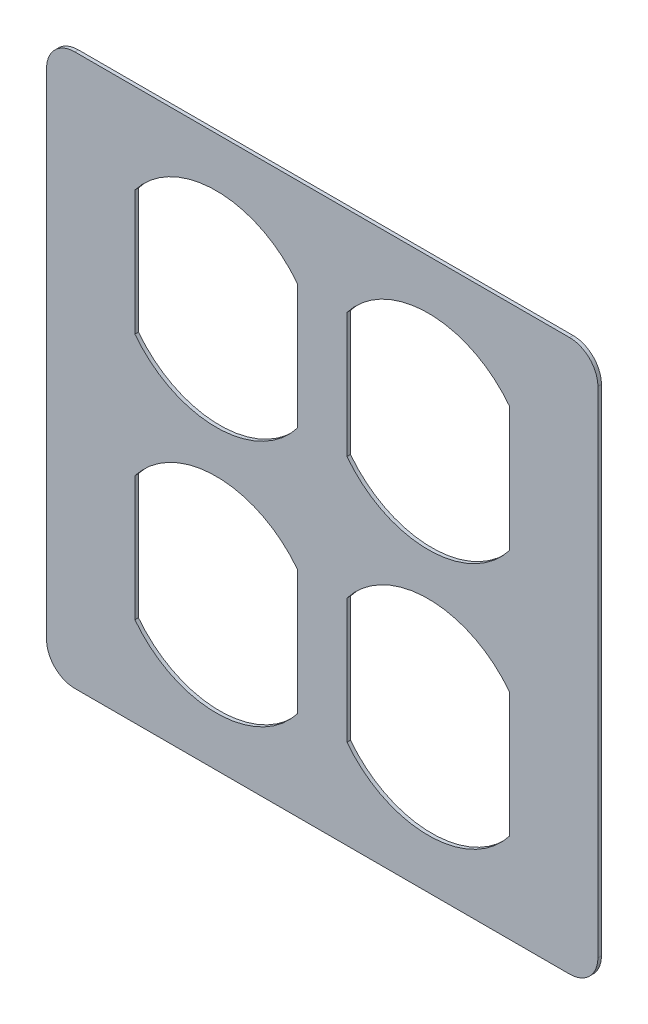
ISO-10303-21;
HEADER;
FILE_DESCRIPTION(('STEP AP214'),'2;1');
FILE_NAME('part.step','',(''),(''),'','','');
FILE_SCHEMA(('AUTOMOTIVE_DESIGN { 1 0 10303 214 1 1 1 1 }'));
ENDSEC;
DATA;
#1=APPLICATION_CONTEXT('core data for automotive mechanical design processes');
#2=APPLICATION_PROTOCOL_DEFINITION('international standard','automotive_design',2000,#1);
#3=PRODUCT_CONTEXT('',#1,'mechanical');
#4=PRODUCT('Part','Part','',(#3));
#5=PRODUCT_RELATED_PRODUCT_CATEGORY('part','',(#4));
#6=PRODUCT_DEFINITION_FORMATION('','',#4);
#7=PRODUCT_DEFINITION_CONTEXT('part definition',#1,'design');
#8=PRODUCT_DEFINITION('design','',#6,#7);
#9=PRODUCT_DEFINITION_SHAPE('','',#8);
#10=(LENGTH_UNIT() NAMED_UNIT(*) SI_UNIT(.MILLI.,.METRE.));
#11=(NAMED_UNIT(*) PLANE_ANGLE_UNIT() SI_UNIT($,.RADIAN.));
#12=(NAMED_UNIT(*) SI_UNIT($,.STERADIAN.) SOLID_ANGLE_UNIT());
#13=UNCERTAINTY_MEASURE_WITH_UNIT(LENGTH_MEASURE(1.E-05),#10,'distance_accuracy_value','');
#14=(GEOMETRIC_REPRESENTATION_CONTEXT(3) GLOBAL_UNCERTAINTY_ASSIGNED_CONTEXT((#13)) GLOBAL_UNIT_ASSIGNED_CONTEXT((#10,
#11,#12)) REPRESENTATION_CONTEXT('',''));
#15=CARTESIAN_POINT('',(0.,0.,0.));
#16=DIRECTION('',(0.,0.,1.));
#17=DIRECTION('',(1.,0.,0.));
#18=AXIS2_PLACEMENT_3D('',#15,#16,#17);
#19=CARTESIAN_POINT('',(0.,0.,0.5));
#20=DIRECTION('',(0.,0.,1.));
#21=DIRECTION('',(1.,0.,0.));
#22=AXIS2_PLACEMENT_3D('',#19,#20,#21);
#23=PLANE('',#22);
#24=DIRECTION('',(0.,1.,0.));
#25=VECTOR('',#24,1.);
#26=CARTESIAN_POINT('',(-26.5,8.66823913367216,0.5));
#27=LINE('',#26,#25);
#28=CARTESIAN_POINT('',(-26.5,8.66823913367216,0.5));
#29=VERTEX_POINT('',#28);
#30=CARTESIAN_POINT('',(-26.5,26.3317608663278,0.5));
#31=VERTEX_POINT('',#30);
#32=EDGE_CURVE('E397',#29,#31,#27,.T.);
#33=ORIENTED_EDGE('',*,*,#32,.T.);
#34=CARTESIAN_POINT('',(-15.,17.5,0.5));
#35=DIRECTION('',(0.,0.,1.));
#36=DIRECTION('',(1.,0.,0.));
#37=AXIS2_PLACEMENT_3D('',#34,#35,#36);
#38=CIRCLE('',#37,14.5);
#39=CARTESIAN_POINT('',(-3.5,26.3317608663278,0.5));
#40=VERTEX_POINT('',#39);
#41=EDGE_CURVE('E388',#31,#40,#38,.F.);
#42=ORIENTED_EDGE('',*,*,#41,.T.);
#43=DIRECTION('',(0.,-1.,0.));
#44=VECTOR('',#43,1.);
#45=CARTESIAN_POINT('',(-3.5,8.66823913367216,0.5));
#46=LINE('',#45,#44);
#47=CARTESIAN_POINT('',(-3.5,8.66823913367216,0.5));
#48=VERTEX_POINT('',#47);
#49=EDGE_CURVE('E391',#40,#48,#46,.T.);
#50=ORIENTED_EDGE('',*,*,#49,.T.);
#51=CARTESIAN_POINT('',(-15.,17.5,0.5));
#52=DIRECTION('',(0.,0.,1.));
#53=DIRECTION('',(1.,0.,0.));
#54=AXIS2_PLACEMENT_3D('',#51,#52,#53);
#55=CIRCLE('',#54,14.5);
#56=EDGE_CURVE('E394',#48,#29,#55,.F.);
#57=ORIENTED_EDGE('',*,*,#56,.T.);
#58=EDGE_LOOP('',(#33,#42,#50,#57));
#59=FACE_BOUND('',#58,.T.);
#60=CARTESIAN_POINT('',(15.,17.5,0.5));
#61=DIRECTION('',(0.,0.,1.));
#62=DIRECTION('',(1.,0.,0.));
#63=AXIS2_PLACEMENT_3D('',#60,#61,#62);
#64=CIRCLE('',#63,14.5);
#65=CARTESIAN_POINT('',(26.5,8.66823913367216,0.5));
#66=VERTEX_POINT('',#65);
#67=CARTESIAN_POINT('',(3.49999999999999,8.66823913367216,0.5));
#68=VERTEX_POINT('',#67);
#69=EDGE_CURVE('E297',#66,#68,#64,.F.);
#70=ORIENTED_EDGE('',*,*,#69,.T.);
#71=DIRECTION('',(0.,1.,0.));
#72=VECTOR('',#71,1.);
#73=CARTESIAN_POINT('',(3.49999999999999,8.66823913367216,0.5));
#74=LINE('',#73,#72);
#75=CARTESIAN_POINT('',(3.49999999999999,26.3317608663278,0.5));
#76=VERTEX_POINT('',#75);
#77=EDGE_CURVE('E294',#68,#76,#74,.T.);
#78=ORIENTED_EDGE('',*,*,#77,.T.);
#79=CARTESIAN_POINT('',(15.,17.5,0.5));
#80=DIRECTION('',(0.,0.,1.));
#81=DIRECTION('',(1.,0.,0.));
#82=AXIS2_PLACEMENT_3D('',#79,#80,#81);
#83=CIRCLE('',#82,14.5);
#84=CARTESIAN_POINT('',(26.5,26.3317608663278,0.5));
#85=VERTEX_POINT('',#84);
#86=EDGE_CURVE('E214',#76,#85,#83,.F.);
#87=ORIENTED_EDGE('',*,*,#86,.T.);
#88=DIRECTION('',(0.,-1.,0.));
#89=VECTOR('',#88,1.);
#90=CARTESIAN_POINT('',(26.5,8.66823913367216,0.5));
#91=LINE('',#90,#89);
#92=EDGE_CURVE('E303',#85,#66,#91,.T.);
#93=ORIENTED_EDGE('',*,*,#92,.T.);
#94=EDGE_LOOP('',(#70,#78,#87,#93));
#95=FACE_BOUND('',#94,.T.);
#96=CARTESIAN_POINT('',(15.,-17.5,0.5));
#97=DIRECTION('',(0.,0.,1.));
#98=DIRECTION('',(1.,0.,0.));
#99=AXIS2_PLACEMENT_3D('',#96,#97,#98);
#100=CIRCLE('',#99,14.5);
#101=CARTESIAN_POINT('',(26.5,-26.3317608663278,0.5));
#102=VERTEX_POINT('',#101);
#103=CARTESIAN_POINT('',(3.49999999999999,-26.3317608663278,0.5));
#104=VERTEX_POINT('',#103);
#105=EDGE_CURVE('E213',#102,#104,#100,.F.);
#106=ORIENTED_EDGE('',*,*,#105,.T.);
#107=DIRECTION('',(0.,1.,0.));
#108=VECTOR('',#107,1.);
#109=CARTESIAN_POINT('',(3.49999999999999,-26.3317608663278,0.5));
#110=LINE('',#109,#108);
#111=CARTESIAN_POINT('',(3.49999999999999,-8.66823913367216,0.5));
#112=VERTEX_POINT('',#111);
#113=EDGE_CURVE('E199',#104,#112,#110,.T.);
#114=ORIENTED_EDGE('',*,*,#113,.T.);
#115=CARTESIAN_POINT('',(15.,-17.5,0.5));
#116=DIRECTION('',(0.,0.,1.));
#117=DIRECTION('',(1.,0.,0.));
#118=AXIS2_PLACEMENT_3D('',#115,#116,#117);
#119=CIRCLE('',#118,14.5);
#120=CARTESIAN_POINT('',(26.5,-8.66823913367216,0.5));
#121=VERTEX_POINT('',#120);
#122=EDGE_CURVE('E211',#112,#121,#119,.F.);
#123=ORIENTED_EDGE('',*,*,#122,.T.);
#124=DIRECTION('',(0.,-1.,0.));
#125=VECTOR('',#124,1.);
#126=CARTESIAN_POINT('',(26.5,-26.3317608663278,0.5));
#127=LINE('',#126,#125);
#128=EDGE_CURVE('E219',#121,#102,#127,.T.);
#129=ORIENTED_EDGE('',*,*,#128,.T.);
#130=EDGE_LOOP('',(#106,#114,#123,#129));
#131=FACE_BOUND('',#130,.T.);
#132=DIRECTION('',(0.,1.,0.));
#133=VECTOR('',#132,1.);
#134=CARTESIAN_POINT('',(-26.5,-26.3317608663278,0.5));
#135=LINE('',#134,#133);
#136=CARTESIAN_POINT('',(-26.5,-26.3317608663278,0.5));
#137=VERTEX_POINT('',#136);
#138=CARTESIAN_POINT('',(-26.5,-8.66823913367216,0.5));
#139=VERTEX_POINT('',#138);
#140=EDGE_CURVE('E289',#137,#139,#135,.T.);
#141=ORIENTED_EDGE('',*,*,#140,.T.);
#142=CARTESIAN_POINT('',(-15.,-17.5,0.5));
#143=DIRECTION('',(0.,0.,1.));
#144=DIRECTION('',(1.,0.,0.));
#145=AXIS2_PLACEMENT_3D('',#142,#143,#144);
#146=CIRCLE('',#145,14.5);
#147=CARTESIAN_POINT('',(-3.5,-8.66823913367216,0.5));
#148=VERTEX_POINT('',#147);
#149=EDGE_CURVE('E400',#139,#148,#146,.F.);
#150=ORIENTED_EDGE('',*,*,#149,.T.);
#151=DIRECTION('',(0.,-1.,0.));
#152=VECTOR('',#151,1.);
#153=CARTESIAN_POINT('',(-3.5,-26.3317608663278,0.5));
#154=LINE('',#153,#152);
#155=CARTESIAN_POINT('',(-3.5,-26.3317608663278,0.5));
#156=VERTEX_POINT('',#155);
#157=EDGE_CURVE('E291',#148,#156,#154,.T.);
#158=ORIENTED_EDGE('',*,*,#157,.T.);
#159=CARTESIAN_POINT('',(-15.,-17.5,0.5));
#160=DIRECTION('',(0.,0.,1.));
#161=DIRECTION('',(1.,0.,0.));
#162=AXIS2_PLACEMENT_3D('',#159,#160,#161);
#163=CIRCLE('',#162,14.5);
#164=EDGE_CURVE('E283',#156,#137,#163,.F.);
#165=ORIENTED_EDGE('',*,*,#164,.T.);
#166=EDGE_LOOP('',(#141,#150,#158,#165));
#167=FACE_BOUND('',#166,.T.);
#168=CARTESIAN_POINT('',(35.,35.,0.5));
#169=DIRECTION('',(0.,0.,1.));
#170=DIRECTION('',(1.,0.,0.));
#171=AXIS2_PLACEMENT_3D('',#168,#169,#170);
#172=CIRCLE('',#171,4.);
#173=CARTESIAN_POINT('',(35.,39.,0.5));
#174=VERTEX_POINT('',#173);
#175=CARTESIAN_POINT('',(39.,35.,0.5));
#176=VERTEX_POINT('',#175);
#177=EDGE_CURVE('E374',#174,#176,#172,.F.);
#178=ORIENTED_EDGE('',*,*,#177,.F.);
#179=DIRECTION('',(-1.,0.,0.));
#180=VECTOR('',#179,1.);
#181=CARTESIAN_POINT('',(-39.,39.,0.5));
#182=LINE('',#181,#180);
#183=CARTESIAN_POINT('',(-35.,39.,0.5));
#184=VERTEX_POINT('',#183);
#185=EDGE_CURVE('E376',#174,#184,#182,.T.);
#186=ORIENTED_EDGE('',*,*,#185,.T.);
#187=CARTESIAN_POINT('',(-35.,35.,0.5));
#188=DIRECTION('',(0.,0.,1.));
#189=DIRECTION('',(1.,0.,0.));
#190=AXIS2_PLACEMENT_3D('',#187,#188,#189);
#191=CIRCLE('',#190,4.);
#192=CARTESIAN_POINT('',(-39.,35.,0.5));
#193=VERTEX_POINT('',#192);
#194=EDGE_CURVE('E370',#193,#184,#191,.F.);
#195=ORIENTED_EDGE('',*,*,#194,.F.);
#196=DIRECTION('',(0.,-1.,0.));
#197=VECTOR('',#196,1.);
#198=CARTESIAN_POINT('',(-39.,-39.,0.5));
#199=LINE('',#198,#197);
#200=CARTESIAN_POINT('',(-39.,-35.,0.5));
#201=VERTEX_POINT('',#200);
#202=EDGE_CURVE('E382',#193,#201,#199,.T.);
#203=ORIENTED_EDGE('',*,*,#202,.T.);
#204=CARTESIAN_POINT('',(-35.,-35.,0.5));
#205=DIRECTION('',(0.,0.,1.));
#206=DIRECTION('',(1.,0.,0.));
#207=AXIS2_PLACEMENT_3D('',#204,#205,#206);
#208=CIRCLE('',#207,4.);
#209=CARTESIAN_POINT('',(-35.,-39.,0.5));
#210=VERTEX_POINT('',#209);
#211=EDGE_CURVE('E227',#210,#201,#208,.F.);
#212=ORIENTED_EDGE('',*,*,#211,.F.);
#213=DIRECTION('',(1.,0.,0.));
#214=VECTOR('',#213,1.);
#215=CARTESIAN_POINT('',(-39.,-39.,0.5));
#216=LINE('',#215,#214);
#217=CARTESIAN_POINT('',(35.,-39.,0.5));
#218=VERTEX_POINT('',#217);
#219=EDGE_CURVE('E385',#210,#218,#216,.T.);
#220=ORIENTED_EDGE('',*,*,#219,.T.);
#221=CARTESIAN_POINT('',(35.,-35.,0.5));
#222=DIRECTION('',(0.,0.,1.));
#223=DIRECTION('',(1.,0.,0.));
#224=AXIS2_PLACEMENT_3D('',#221,#222,#223);
#225=CIRCLE('',#224,4.);
#226=CARTESIAN_POINT('',(39.,-35.,0.5));
#227=VERTEX_POINT('',#226);
#228=EDGE_CURVE('E372',#227,#218,#225,.F.);
#229=ORIENTED_EDGE('',*,*,#228,.F.);
#230=DIRECTION('',(0.,1.,0.));
#231=VECTOR('',#230,1.);
#232=CARTESIAN_POINT('',(39.,-39.,0.5));
#233=LINE('',#232,#231);
#234=EDGE_CURVE('E379',#227,#176,#233,.T.);
#235=ORIENTED_EDGE('',*,*,#234,.T.);
#236=EDGE_LOOP('',(#178,#186,#195,#203,#212,#220,#229,#235));
#237=FACE_BOUND('',#236,.T.);
#238=ADVANCED_FACE('F33',(#59,#95,#131,#167,#237),#23,.T.);
#239=CARTESIAN_POINT('',(-39.,39.,0.5));
#240=DIRECTION('',(0.,-1.,0.));
#241=DIRECTION('',(0.,0.,-1.));
#242=AXIS2_PLACEMENT_3D('',#239,#240,#241);
#243=PLANE('',#242);
#244=ORIENTED_EDGE('',*,*,#185,.F.);
#245=DIRECTION('',(0.,0.,-1.));
#246=VECTOR('',#245,1.);
#247=CARTESIAN_POINT('',(35.,39.,0.5));
#248=LINE('',#247,#246);
#249=CARTESIAN_POINT('',(35.,39.,0.));
#250=VERTEX_POINT('',#249);
#251=EDGE_CURVE('E257',#174,#250,#248,.T.);
#252=ORIENTED_EDGE('',*,*,#251,.T.);
#253=DIRECTION('',(-1.,0.,0.));
#254=VECTOR('',#253,1.);
#255=CARTESIAN_POINT('',(-39.,39.,0.));
#256=LINE('',#255,#254);
#257=CARTESIAN_POINT('',(-35.,39.,0.));
#258=VERTEX_POINT('',#257);
#259=EDGE_CURVE('E348',#250,#258,#256,.T.);
#260=ORIENTED_EDGE('',*,*,#259,.T.);
#261=DIRECTION('',(0.,0.,-1.));
#262=VECTOR('',#261,1.);
#263=CARTESIAN_POINT('',(-35.,39.,0.5));
#264=LINE('',#263,#262);
#265=EDGE_CURVE('E259',#258,#184,#264,.F.);
#266=ORIENTED_EDGE('',*,*,#265,.T.);
#267=EDGE_LOOP('',(#244,#252,#260,#266));
#268=FACE_BOUND('',#267,.T.);
#269=ADVANCED_FACE('F422',(#268),#243,.F.);
#270=CARTESIAN_POINT('',(39.,-39.,0.5));
#271=DIRECTION('',(-1.,0.,0.));
#272=DIRECTION('',(0.,0.,1.));
#273=AXIS2_PLACEMENT_3D('',#270,#271,#272);
#274=PLANE('',#273);
#275=ORIENTED_EDGE('',*,*,#234,.F.);
#276=DIRECTION('',(0.,0.,-1.));
#277=VECTOR('',#276,1.);
#278=CARTESIAN_POINT('',(39.,-35.,0.5));
#279=LINE('',#278,#277);
#280=CARTESIAN_POINT('',(39.,-35.,0.));
#281=VERTEX_POINT('',#280);
#282=EDGE_CURVE('E254',#227,#281,#279,.T.);
#283=ORIENTED_EDGE('',*,*,#282,.T.);
#284=DIRECTION('',(0.,1.,0.));
#285=VECTOR('',#284,1.);
#286=CARTESIAN_POINT('',(39.,-39.,0.));
#287=LINE('',#286,#285);
#288=CARTESIAN_POINT('',(39.,35.,0.));
#289=VERTEX_POINT('',#288);
#290=EDGE_CURVE('E267',#281,#289,#287,.T.);
#291=ORIENTED_EDGE('',*,*,#290,.T.);
#292=DIRECTION('',(0.,0.,-1.));
#293=VECTOR('',#292,1.);
#294=CARTESIAN_POINT('',(39.,35.,0.5));
#295=LINE('',#294,#293);
#296=EDGE_CURVE('E251',#289,#176,#295,.F.);
#297=ORIENTED_EDGE('',*,*,#296,.T.);
#298=EDGE_LOOP('',(#275,#283,#291,#297));
#299=FACE_BOUND('',#298,.T.);
#300=ADVANCED_FACE('F424',(#299),#274,.F.);
#301=CARTESIAN_POINT('',(-39.,-39.,0.5));
#302=DIRECTION('',(1.,0.,0.));
#303=DIRECTION('',(0.,0.,-1.));
#304=AXIS2_PLACEMENT_3D('',#301,#302,#303);
#305=PLANE('',#304);
#306=ORIENTED_EDGE('',*,*,#202,.F.);
#307=DIRECTION('',(0.,0.,-1.));
#308=VECTOR('',#307,1.);
#309=CARTESIAN_POINT('',(-39.,35.,0.5));
#310=LINE('',#309,#308);
#311=CARTESIAN_POINT('',(-39.,35.,0.));
#312=VERTEX_POINT('',#311);
#313=EDGE_CURVE('E240',#193,#312,#310,.T.);
#314=ORIENTED_EDGE('',*,*,#313,.T.);
#315=DIRECTION('',(0.,-1.,0.));
#316=VECTOR('',#315,1.);
#317=CARTESIAN_POINT('',(-39.,-39.,0.));
#318=LINE('',#317,#316);
#319=CARTESIAN_POINT('',(-39.,-35.,0.));
#320=VERTEX_POINT('',#319);
#321=EDGE_CURVE('E346',#312,#320,#318,.T.);
#322=ORIENTED_EDGE('',*,*,#321,.T.);
#323=DIRECTION('',(0.,0.,-1.));
#324=VECTOR('',#323,1.);
#325=CARTESIAN_POINT('',(-39.,-35.,0.5));
#326=LINE('',#325,#324);
#327=EDGE_CURVE('E242',#320,#201,#326,.F.);
#328=ORIENTED_EDGE('',*,*,#327,.T.);
#329=EDGE_LOOP('',(#306,#314,#322,#328));
#330=FACE_BOUND('',#329,.T.);
#331=ADVANCED_FACE('F431',(#330),#305,.F.);
#332=CARTESIAN_POINT('',(-39.,-39.,0.5));
#333=DIRECTION('',(0.,1.,0.));
#334=DIRECTION('',(0.,0.,1.));
#335=AXIS2_PLACEMENT_3D('',#332,#333,#334);
#336=PLANE('',#335);
#337=ORIENTED_EDGE('',*,*,#219,.F.);
#338=DIRECTION('',(0.,0.,-1.));
#339=VECTOR('',#338,1.);
#340=CARTESIAN_POINT('',(-35.,-39.,0.5));
#341=LINE('',#340,#339);
#342=CARTESIAN_POINT('',(-35.,-39.,0.));
#343=VERTEX_POINT('',#342);
#344=EDGE_CURVE('E249',#210,#343,#341,.T.);
#345=ORIENTED_EDGE('',*,*,#344,.T.);
#346=DIRECTION('',(1.,0.,0.));
#347=VECTOR('',#346,1.);
#348=CARTESIAN_POINT('',(-39.,-39.,0.));
#349=LINE('',#348,#347);
#350=CARTESIAN_POINT('',(35.,-39.,0.));
#351=VERTEX_POINT('',#350);
#352=EDGE_CURVE('E263',#343,#351,#349,.T.);
#353=ORIENTED_EDGE('',*,*,#352,.T.);
#354=DIRECTION('',(0.,0.,-1.));
#355=VECTOR('',#354,1.);
#356=CARTESIAN_POINT('',(35.,-39.,0.5));
#357=LINE('',#356,#355);
#358=EDGE_CURVE('E246',#351,#218,#357,.F.);
#359=ORIENTED_EDGE('',*,*,#358,.T.);
#360=EDGE_LOOP('',(#337,#345,#353,#359));
#361=FACE_BOUND('',#360,.T.);
#362=ADVANCED_FACE('F441',(#361),#336,.F.);
#363=CARTESIAN_POINT('',(35.,35.,0.5));
#364=DIRECTION('',(0.,0.,-1.));
#365=DIRECTION('',(-1.,0.,0.));
#366=AXIS2_PLACEMENT_3D('',#363,#364,#365);
#367=CYLINDRICAL_SURFACE('',#366,4.);
#368=ORIENTED_EDGE('',*,*,#251,.F.);
#369=ORIENTED_EDGE('',*,*,#177,.T.);
#370=ORIENTED_EDGE('',*,*,#296,.F.);
#371=CARTESIAN_POINT('',(35.,35.,0.));
#372=DIRECTION('',(0.,0.,-1.));
#373=DIRECTION('',(-1.,0.,0.));
#374=AXIS2_PLACEMENT_3D('',#371,#372,#373);
#375=CIRCLE('',#374,4.);
#376=EDGE_CURVE('E256',#250,#289,#375,.T.);
#377=ORIENTED_EDGE('',*,*,#376,.F.);
#378=EDGE_LOOP('',(#368,#369,#370,#377));
#379=FACE_BOUND('',#378,.T.);
#380=ADVANCED_FACE('F35',(#379),#367,.T.);
#381=CARTESIAN_POINT('',(35.,-35.,0.5));
#382=DIRECTION('',(0.,0.,-1.));
#383=DIRECTION('',(-1.,0.,0.));
#384=AXIS2_PLACEMENT_3D('',#381,#382,#383);
#385=CYLINDRICAL_SURFACE('',#384,4.);
#386=ORIENTED_EDGE('',*,*,#282,.F.);
#387=ORIENTED_EDGE('',*,*,#228,.T.);
#388=ORIENTED_EDGE('',*,*,#358,.F.);
#389=CARTESIAN_POINT('',(35.,-35.,0.));
#390=DIRECTION('',(0.,0.,-1.));
#391=DIRECTION('',(-1.,0.,0.));
#392=AXIS2_PLACEMENT_3D('',#389,#390,#391);
#393=CIRCLE('',#392,4.);
#394=EDGE_CURVE('E338',#281,#351,#393,.T.);
#395=ORIENTED_EDGE('',*,*,#394,.F.);
#396=EDGE_LOOP('',(#386,#387,#388,#395));
#397=FACE_BOUND('',#396,.T.);
#398=ADVANCED_FACE('F625',(#397),#385,.T.);
#399=CARTESIAN_POINT('',(-35.,35.,0.5));
#400=DIRECTION('',(0.,0.,-1.));
#401=DIRECTION('',(-1.,0.,0.));
#402=AXIS2_PLACEMENT_3D('',#399,#400,#401);
#403=CYLINDRICAL_SURFACE('',#402,4.);
#404=ORIENTED_EDGE('',*,*,#313,.F.);
#405=ORIENTED_EDGE('',*,*,#194,.T.);
#406=ORIENTED_EDGE('',*,*,#265,.F.);
#407=CARTESIAN_POINT('',(-35.,35.,0.));
#408=DIRECTION('',(0.,0.,-1.));
#409=DIRECTION('',(-1.,0.,0.));
#410=AXIS2_PLACEMENT_3D('',#407,#408,#409);
#411=CIRCLE('',#410,4.);
#412=EDGE_CURVE('E341',#312,#258,#411,.T.);
#413=ORIENTED_EDGE('',*,*,#412,.F.);
#414=EDGE_LOOP('',(#404,#405,#406,#413));
#415=FACE_BOUND('',#414,.T.);
#416=ADVANCED_FACE('F614',(#415),#403,.T.);
#417=CARTESIAN_POINT('',(-35.,-35.,0.5));
#418=DIRECTION('',(0.,0.,-1.));
#419=DIRECTION('',(-1.,0.,0.));
#420=AXIS2_PLACEMENT_3D('',#417,#418,#419);
#421=CYLINDRICAL_SURFACE('',#420,4.);
#422=ORIENTED_EDGE('',*,*,#344,.F.);
#423=ORIENTED_EDGE('',*,*,#211,.T.);
#424=ORIENTED_EDGE('',*,*,#327,.F.);
#425=CARTESIAN_POINT('',(-35.,-35.,0.));
#426=DIRECTION('',(0.,0.,-1.));
#427=DIRECTION('',(-1.,0.,0.));
#428=AXIS2_PLACEMENT_3D('',#425,#426,#427);
#429=CIRCLE('',#428,4.);
#430=EDGE_CURVE('E260',#343,#320,#429,.T.);
#431=ORIENTED_EDGE('',*,*,#430,.F.);
#432=EDGE_LOOP('',(#422,#423,#424,#431));
#433=FACE_BOUND('',#432,.T.);
#434=ADVANCED_FACE('F603',(#433),#421,.T.);
#435=CARTESIAN_POINT('',(-15.,17.5,0.));
#436=DIRECTION('',(0.,0.,1.));
#437=DIRECTION('',(1.,0.,0.));
#438=AXIS2_PLACEMENT_3D('',#435,#436,#437);
#439=CYLINDRICAL_SURFACE('',#438,14.5);
#440=ORIENTED_EDGE('',*,*,#41,.F.);
#441=DIRECTION('',(0.,0.,1.));
#442=VECTOR('',#441,1.);
#443=CARTESIAN_POINT('',(-26.5,26.3317608663278,0.));
#444=LINE('',#443,#442);
#445=CARTESIAN_POINT('',(-26.5,26.3317608663278,0.));
#446=VERTEX_POINT('',#445);
#447=EDGE_CURVE('E271',#446,#31,#444,.T.);
#448=ORIENTED_EDGE('',*,*,#447,.F.);
#449=CARTESIAN_POINT('',(-15.,17.5,0.));
#450=DIRECTION('',(0.,0.,1.));
#451=DIRECTION('',(-1.,0.,0.));
#452=AXIS2_PLACEMENT_3D('',#449,#450,#451);
#453=CIRCLE('',#452,14.5);
#454=CARTESIAN_POINT('',(-3.5,26.3317608663278,0.));
#455=VERTEX_POINT('',#454);
#456=EDGE_CURVE('E360',#455,#446,#453,.T.);
#457=ORIENTED_EDGE('',*,*,#456,.F.);
#458=DIRECTION('',(0.,0.,1.));
#459=VECTOR('',#458,1.);
#460=CARTESIAN_POINT('',(-3.5,26.3317608663278,0.));
#461=LINE('',#460,#459);
#462=EDGE_CURVE('E264',#455,#40,#461,.T.);
#463=ORIENTED_EDGE('',*,*,#462,.T.);
#464=EDGE_LOOP('',(#440,#448,#457,#463));
#465=FACE_BOUND('',#464,.T.);
#466=ADVANCED_FACE('F445',(#465),#439,.F.);
#467=CARTESIAN_POINT('',(-3.5,8.66823913367216,0.));
#468=DIRECTION('',(1.,0.,0.));
#469=DIRECTION('',(0.,1.,0.));
#470=AXIS2_PLACEMENT_3D('',#467,#468,#469);
#471=PLANE('',#470);
#472=ORIENTED_EDGE('',*,*,#49,.F.);
#473=ORIENTED_EDGE('',*,*,#462,.F.);
#474=DIRECTION('',(0.,1.,0.));
#475=VECTOR('',#474,1.);
#476=CARTESIAN_POINT('',(-3.5,8.66823913367216,0.));
#477=LINE('',#476,#475);
#478=CARTESIAN_POINT('',(-3.5,8.66823913367216,0.));
#479=VERTEX_POINT('',#478);
#480=EDGE_CURVE('E273',#479,#455,#477,.T.);
#481=ORIENTED_EDGE('',*,*,#480,.F.);
#482=DIRECTION('',(0.,0.,1.));
#483=VECTOR('',#482,1.);
#484=CARTESIAN_POINT('',(-3.5,8.66823913367216,0.));
#485=LINE('',#484,#483);
#486=EDGE_CURVE('E266',#479,#48,#485,.T.);
#487=ORIENTED_EDGE('',*,*,#486,.T.);
#488=EDGE_LOOP('',(#472,#473,#481,#487));
#489=FACE_BOUND('',#488,.T.);
#490=ADVANCED_FACE('F443',(#489),#471,.F.);
#491=CARTESIAN_POINT('',(-15.,17.5,0.));
#492=DIRECTION('',(0.,0.,1.));
#493=DIRECTION('',(1.,0.,0.));
#494=AXIS2_PLACEMENT_3D('',#491,#492,#493);
#495=CYLINDRICAL_SURFACE('',#494,14.5);
#496=ORIENTED_EDGE('',*,*,#56,.F.);
#497=ORIENTED_EDGE('',*,*,#486,.F.);
#498=CARTESIAN_POINT('',(-15.,17.5,0.));
#499=DIRECTION('',(0.,0.,1.));
#500=DIRECTION('',(1.,0.,0.));
#501=AXIS2_PLACEMENT_3D('',#498,#499,#500);
#502=CIRCLE('',#501,14.5);
#503=CARTESIAN_POINT('',(-26.5,8.66823913367216,0.));
#504=VERTEX_POINT('',#503);
#505=EDGE_CURVE('E354',#504,#479,#502,.T.);
#506=ORIENTED_EDGE('',*,*,#505,.F.);
#507=DIRECTION('',(0.,0.,1.));
#508=VECTOR('',#507,1.);
#509=CARTESIAN_POINT('',(-26.5,8.66823913367216,0.));
#510=LINE('',#509,#508);
#511=EDGE_CURVE('E269',#504,#29,#510,.T.);
#512=ORIENTED_EDGE('',*,*,#511,.T.);
#513=EDGE_LOOP('',(#496,#497,#506,#512));
#514=FACE_BOUND('',#513,.T.);
#515=ADVANCED_FACE('F417',(#514),#495,.F.);
#516=CARTESIAN_POINT('',(-26.5,8.66823913367216,0.));
#517=DIRECTION('',(-1.,0.,0.));
#518=DIRECTION('',(0.,0.,1.));
#519=AXIS2_PLACEMENT_3D('',#516,#517,#518);
#520=PLANE('',#519);
#521=ORIENTED_EDGE('',*,*,#32,.F.);
#522=ORIENTED_EDGE('',*,*,#511,.F.);
#523=DIRECTION('',(0.,-1.,0.));
#524=VECTOR('',#523,1.);
#525=CARTESIAN_POINT('',(-26.5,8.66823913367216,0.));
#526=LINE('',#525,#524);
#527=EDGE_CURVE('E357',#446,#504,#526,.T.);
#528=ORIENTED_EDGE('',*,*,#527,.F.);
#529=ORIENTED_EDGE('',*,*,#447,.T.);
#530=EDGE_LOOP('',(#521,#522,#528,#529));
#531=FACE_BOUND('',#530,.T.);
#532=ADVANCED_FACE('F410',(#531),#520,.F.);
#533=CARTESIAN_POINT('',(-15.,-17.5,0.));
#534=DIRECTION('',(0.,0.,1.));
#535=DIRECTION('',(1.,0.,0.));
#536=AXIS2_PLACEMENT_3D('',#533,#534,#535);
#537=CYLINDRICAL_SURFACE('',#536,14.5);
#538=ORIENTED_EDGE('',*,*,#149,.F.);
#539=DIRECTION('',(0.,0.,1.));
#540=VECTOR('',#539,1.);
#541=CARTESIAN_POINT('',(-26.5,-8.66823913367216,0.));
#542=LINE('',#541,#540);
#543=CARTESIAN_POINT('',(-26.5,-8.66823913367216,0.));
#544=VERTEX_POINT('',#543);
#545=EDGE_CURVE('E278',#544,#139,#542,.T.);
#546=ORIENTED_EDGE('',*,*,#545,.F.);
#547=CARTESIAN_POINT('',(-15.,-17.5,0.));
#548=DIRECTION('',(0.,0.,1.));
#549=DIRECTION('',(-1.,0.,0.));
#550=AXIS2_PLACEMENT_3D('',#547,#548,#549);
#551=CIRCLE('',#550,14.5);
#552=CARTESIAN_POINT('',(-3.5,-8.66823913367216,0.));
#553=VERTEX_POINT('',#552);
#554=EDGE_CURVE('E363',#553,#544,#551,.T.);
#555=ORIENTED_EDGE('',*,*,#554,.F.);
#556=DIRECTION('',(0.,0.,1.));
#557=VECTOR('',#556,1.);
#558=CARTESIAN_POINT('',(-3.5,-8.66823913367216,0.));
#559=LINE('',#558,#557);
#560=EDGE_CURVE('E274',#553,#148,#559,.T.);
#561=ORIENTED_EDGE('',*,*,#560,.T.);
#562=EDGE_LOOP('',(#538,#546,#555,#561));
#563=FACE_BOUND('',#562,.T.);
#564=ADVANCED_FACE('F408',(#563),#537,.F.);
#565=CARTESIAN_POINT('',(-3.5,-26.3317608663278,0.));
#566=DIRECTION('',(1.,0.,0.));
#567=DIRECTION('',(0.,1.,0.));
#568=AXIS2_PLACEMENT_3D('',#565,#566,#567);
#569=PLANE('',#568);
#570=ORIENTED_EDGE('',*,*,#157,.F.);
#571=ORIENTED_EDGE('',*,*,#560,.F.);
#572=DIRECTION('',(0.,1.,0.));
#573=VECTOR('',#572,1.);
#574=CARTESIAN_POINT('',(-3.5,-26.3317608663278,0.));
#575=LINE('',#574,#573);
#576=CARTESIAN_POINT('',(-3.5,-26.3317608663278,0.));
#577=VERTEX_POINT('',#576);
#578=EDGE_CURVE('E277',#577,#553,#575,.T.);
#579=ORIENTED_EDGE('',*,*,#578,.F.);
#580=DIRECTION('',(0.,0.,1.));
#581=VECTOR('',#580,1.);
#582=CARTESIAN_POINT('',(-3.5,-26.3317608663278,0.));
#583=LINE('',#582,#581);
#584=EDGE_CURVE('E55',#577,#156,#583,.T.);
#585=ORIENTED_EDGE('',*,*,#584,.T.);
#586=EDGE_LOOP('',(#570,#571,#579,#585));
#587=FACE_BOUND('',#586,.T.);
#588=ADVANCED_FACE('F403',(#587),#569,.F.);
#589=CARTESIAN_POINT('',(-15.,-17.5,0.));
#590=DIRECTION('',(0.,0.,1.));
#591=DIRECTION('',(1.,0.,0.));
#592=AXIS2_PLACEMENT_3D('',#589,#590,#591);
#593=CYLINDRICAL_SURFACE('',#592,14.5);
#594=ORIENTED_EDGE('',*,*,#164,.F.);
#595=ORIENTED_EDGE('',*,*,#584,.F.);
#596=CARTESIAN_POINT('',(-15.,-17.5,0.));
#597=DIRECTION('',(0.,0.,1.));
#598=DIRECTION('',(1.,0.,0.));
#599=AXIS2_PLACEMENT_3D('',#596,#597,#598);
#600=CIRCLE('',#599,14.5);
#601=CARTESIAN_POINT('',(-26.5,-26.3317608663278,0.));
#602=VERTEX_POINT('',#601);
#603=EDGE_CURVE('E276',#602,#577,#600,.T.);
#604=ORIENTED_EDGE('',*,*,#603,.F.);
#605=DIRECTION('',(0.,0.,1.));
#606=VECTOR('',#605,1.);
#607=CARTESIAN_POINT('',(-26.5,-26.3317608663278,0.));
#608=LINE('',#607,#606);
#609=EDGE_CURVE('E37',#602,#137,#608,.T.);
#610=ORIENTED_EDGE('',*,*,#609,.T.);
#611=EDGE_LOOP('',(#594,#595,#604,#610));
#612=FACE_BOUND('',#611,.T.);
#613=ADVANCED_FACE('F282',(#612),#593,.F.);
#614=CARTESIAN_POINT('',(-26.5,-26.3317608663278,0.));
#615=DIRECTION('',(-1.,0.,0.));
#616=DIRECTION('',(0.,0.,1.));
#617=AXIS2_PLACEMENT_3D('',#614,#615,#616);
#618=PLANE('',#617);
#619=ORIENTED_EDGE('',*,*,#140,.F.);
#620=ORIENTED_EDGE('',*,*,#609,.F.);
#621=DIRECTION('',(0.,-1.,0.));
#622=VECTOR('',#621,1.);
#623=CARTESIAN_POINT('',(-26.5,-26.3317608663278,0.));
#624=LINE('',#623,#622);
#625=EDGE_CURVE('E11',#544,#602,#624,.T.);
#626=ORIENTED_EDGE('',*,*,#625,.F.);
#627=ORIENTED_EDGE('',*,*,#545,.T.);
#628=EDGE_LOOP('',(#619,#620,#626,#627));
#629=FACE_BOUND('',#628,.T.);
#630=ADVANCED_FACE('F293',(#629),#618,.F.);
#631=CARTESIAN_POINT('',(3.49999999999999,8.66823913367216,0.));
#632=DIRECTION('',(-1.,0.,0.));
#633=DIRECTION('',(0.,0.,1.));
#634=AXIS2_PLACEMENT_3D('',#631,#632,#633);
#635=PLANE('',#634);
#636=ORIENTED_EDGE('',*,*,#77,.F.);
#637=DIRECTION('',(0.,0.,1.));
#638=VECTOR('',#637,1.);
#639=CARTESIAN_POINT('',(3.49999999999999,8.66823913367216,0.));
#640=LINE('',#639,#638);
#641=CARTESIAN_POINT('',(3.49999999999999,8.66823913367216,0.));
#642=VERTEX_POINT('',#641);
#643=EDGE_CURVE('E230',#642,#68,#640,.T.);
#644=ORIENTED_EDGE('',*,*,#643,.F.);
#645=DIRECTION('',(0.,-1.,0.));
#646=VECTOR('',#645,1.);
#647=CARTESIAN_POINT('',(3.49999999999999,8.66823913367216,0.));
#648=LINE('',#647,#646);
#649=CARTESIAN_POINT('',(3.49999999999999,26.3317608663278,0.));
#650=VERTEX_POINT('',#649);
#651=EDGE_CURVE('E329',#650,#642,#648,.T.);
#652=ORIENTED_EDGE('',*,*,#651,.F.);
#653=DIRECTION('',(0.,0.,1.));
#654=VECTOR('',#653,1.);
#655=CARTESIAN_POINT('',(3.49999999999999,26.3317608663278,0.));
#656=LINE('',#655,#654);
#657=EDGE_CURVE('E237',#650,#76,#656,.T.);
#658=ORIENTED_EDGE('',*,*,#657,.T.);
#659=EDGE_LOOP('',(#636,#644,#652,#658));
#660=FACE_BOUND('',#659,.T.);
#661=ADVANCED_FACE('F328',(#660),#635,.F.);
#662=CARTESIAN_POINT('',(15.,17.5,0.));
#663=DIRECTION('',(0.,0.,1.));
#664=DIRECTION('',(1.,0.,0.));
#665=AXIS2_PLACEMENT_3D('',#662,#663,#664);
#666=CYLINDRICAL_SURFACE('',#665,14.5);
#667=ORIENTED_EDGE('',*,*,#69,.F.);
#668=DIRECTION('',(0.,0.,1.));
#669=VECTOR('',#668,1.);
#670=CARTESIAN_POINT('',(26.5,8.66823913367216,0.));
#671=LINE('',#670,#669);
#672=CARTESIAN_POINT('',(26.5,8.66823913367216,0.));
#673=VERTEX_POINT('',#672);
#674=EDGE_CURVE('E232',#673,#66,#671,.T.);
#675=ORIENTED_EDGE('',*,*,#674,.F.);
#676=CARTESIAN_POINT('',(15.,17.5,0.));
#677=DIRECTION('',(0.,0.,1.));
#678=DIRECTION('',(1.,0.,0.));
#679=AXIS2_PLACEMENT_3D('',#676,#677,#678);
#680=CIRCLE('',#679,14.5);
#681=EDGE_CURVE('E325',#642,#673,#680,.T.);
#682=ORIENTED_EDGE('',*,*,#681,.F.);
#683=ORIENTED_EDGE('',*,*,#643,.T.);
#684=EDGE_LOOP('',(#667,#675,#682,#683));
#685=FACE_BOUND('',#684,.T.);
#686=ADVANCED_FACE('F323',(#685),#666,.F.);
#687=CARTESIAN_POINT('',(26.5,8.66823913367216,0.));
#688=DIRECTION('',(1.,0.,0.));
#689=DIRECTION('',(0.,1.,0.));
#690=AXIS2_PLACEMENT_3D('',#687,#688,#689);
#691=PLANE('',#690);
#692=ORIENTED_EDGE('',*,*,#92,.F.);
#693=DIRECTION('',(0.,0.,1.));
#694=VECTOR('',#693,1.);
#695=CARTESIAN_POINT('',(26.5,26.3317608663278,0.));
#696=LINE('',#695,#694);
#697=CARTESIAN_POINT('',(26.5,26.3317608663278,0.));
#698=VERTEX_POINT('',#697);
#699=EDGE_CURVE('E235',#698,#85,#696,.T.);
#700=ORIENTED_EDGE('',*,*,#699,.F.);
#701=DIRECTION('',(0.,1.,0.));
#702=VECTOR('',#701,1.);
#703=CARTESIAN_POINT('',(26.5,8.66823913367216,0.));
#704=LINE('',#703,#702);
#705=EDGE_CURVE('E239',#673,#698,#704,.T.);
#706=ORIENTED_EDGE('',*,*,#705,.F.);
#707=ORIENTED_EDGE('',*,*,#674,.T.);
#708=EDGE_LOOP('',(#692,#700,#706,#707));
#709=FACE_BOUND('',#708,.T.);
#710=ADVANCED_FACE('F318',(#709),#691,.F.);
#711=CARTESIAN_POINT('',(15.,17.5,0.));
#712=DIRECTION('',(0.,0.,1.));
#713=DIRECTION('',(1.,0.,0.));
#714=AXIS2_PLACEMENT_3D('',#711,#712,#713);
#715=CYLINDRICAL_SURFACE('',#714,14.5);
#716=ORIENTED_EDGE('',*,*,#86,.F.);
#717=ORIENTED_EDGE('',*,*,#657,.F.);
#718=CARTESIAN_POINT('',(15.,17.5,0.));
#719=DIRECTION('',(0.,0.,1.));
#720=DIRECTION('',(-1.,0.,0.));
#721=AXIS2_PLACEMENT_3D('',#718,#719,#720);
#722=CIRCLE('',#721,14.5);
#723=EDGE_CURVE('E243',#698,#650,#722,.T.);
#724=ORIENTED_EDGE('',*,*,#723,.F.);
#725=ORIENTED_EDGE('',*,*,#699,.T.);
#726=EDGE_LOOP('',(#716,#717,#724,#725));
#727=FACE_BOUND('',#726,.T.);
#728=ADVANCED_FACE('F313',(#727),#715,.F.);
#729=CARTESIAN_POINT('',(3.49999999999999,-26.3317608663278,0.));
#730=DIRECTION('',(-1.,0.,0.));
#731=DIRECTION('',(0.,0.,1.));
#732=AXIS2_PLACEMENT_3D('',#729,#730,#731);
#733=PLANE('',#732);
#734=ORIENTED_EDGE('',*,*,#113,.F.);
#735=DIRECTION('',(0.,0.,1.));
#736=VECTOR('',#735,1.);
#737=CARTESIAN_POINT('',(3.49999999999999,-26.3317608663278,0.));
#738=LINE('',#737,#736);
#739=CARTESIAN_POINT('',(3.49999999999999,-26.3317608663278,0.));
#740=VERTEX_POINT('',#739);
#741=EDGE_CURVE('E224',#740,#104,#738,.T.);
#742=ORIENTED_EDGE('',*,*,#741,.F.);
#743=DIRECTION('',(0.,-1.,0.));
#744=VECTOR('',#743,1.);
#745=CARTESIAN_POINT('',(3.49999999999999,-26.3317608663278,0.));
#746=LINE('',#745,#744);
#747=CARTESIAN_POINT('',(3.49999999999999,-8.66823913367216,0.));
#748=VERTEX_POINT('',#747);
#749=EDGE_CURVE('E201',#748,#740,#746,.T.);
#750=ORIENTED_EDGE('',*,*,#749,.F.);
#751=DIRECTION('',(0.,0.,1.));
#752=VECTOR('',#751,1.);
#753=CARTESIAN_POINT('',(3.49999999999999,-8.66823913367216,0.));
#754=LINE('',#753,#752);
#755=EDGE_CURVE('E195',#748,#112,#754,.T.);
#756=ORIENTED_EDGE('',*,*,#755,.T.);
#757=EDGE_LOOP('',(#734,#742,#750,#756));
#758=FACE_BOUND('',#757,.T.);
#759=ADVANCED_FACE('F197',(#758),#733,.F.);
#760=CARTESIAN_POINT('',(15.,-17.5,0.));
#761=DIRECTION('',(0.,0.,1.));
#762=DIRECTION('',(1.,0.,0.));
#763=AXIS2_PLACEMENT_3D('',#760,#761,#762);
#764=CYLINDRICAL_SURFACE('',#763,14.5);
#765=ORIENTED_EDGE('',*,*,#105,.F.);
#766=DIRECTION('',(0.,0.,1.));
#767=VECTOR('',#766,1.);
#768=CARTESIAN_POINT('',(26.5,-26.3317608663278,0.));
#769=LINE('',#768,#767);
#770=CARTESIAN_POINT('',(26.5,-26.3317608663278,0.));
#771=VERTEX_POINT('',#770);
#772=EDGE_CURVE('E226',#771,#102,#769,.T.);
#773=ORIENTED_EDGE('',*,*,#772,.F.);
#774=CARTESIAN_POINT('',(15.,-17.5,0.));
#775=DIRECTION('',(0.,0.,1.));
#776=DIRECTION('',(1.,0.,0.));
#777=AXIS2_PLACEMENT_3D('',#774,#775,#776);
#778=CIRCLE('',#777,14.5);
#779=EDGE_CURVE('E767',#740,#771,#778,.T.);
#780=ORIENTED_EDGE('',*,*,#779,.F.);
#781=ORIENTED_EDGE('',*,*,#741,.T.);
#782=EDGE_LOOP('',(#765,#773,#780,#781));
#783=FACE_BOUND('',#782,.T.);
#784=ADVANCED_FACE('F450',(#783),#764,.F.);
#785=CARTESIAN_POINT('',(26.5,-26.3317608663278,0.));
#786=DIRECTION('',(1.,0.,0.));
#787=DIRECTION('',(0.,1.,0.));
#788=AXIS2_PLACEMENT_3D('',#785,#786,#787);
#789=PLANE('',#788);
#790=ORIENTED_EDGE('',*,*,#128,.F.);
#791=DIRECTION('',(0.,0.,1.));
#792=VECTOR('',#791,1.);
#793=CARTESIAN_POINT('',(26.5,-8.66823913367216,0.));
#794=LINE('',#793,#792);
#795=CARTESIAN_POINT('',(26.5,-8.66823913367216,0.));
#796=VERTEX_POINT('',#795);
#797=EDGE_CURVE('E205',#796,#121,#794,.T.);
#798=ORIENTED_EDGE('',*,*,#797,.F.);
#799=DIRECTION('',(0.,1.,0.));
#800=VECTOR('',#799,1.);
#801=CARTESIAN_POINT('',(26.5,-26.3317608663278,0.));
#802=LINE('',#801,#800);
#803=EDGE_CURVE('E204',#771,#796,#802,.T.);
#804=ORIENTED_EDGE('',*,*,#803,.F.);
#805=ORIENTED_EDGE('',*,*,#772,.T.);
#806=EDGE_LOOP('',(#790,#798,#804,#805));
#807=FACE_BOUND('',#806,.T.);
#808=ADVANCED_FACE('F453',(#807),#789,.F.);
#809=CARTESIAN_POINT('',(15.,-17.5,0.));
#810=DIRECTION('',(0.,0.,1.));
#811=DIRECTION('',(1.,0.,0.));
#812=AXIS2_PLACEMENT_3D('',#809,#810,#811);
#813=CYLINDRICAL_SURFACE('',#812,14.5);
#814=ORIENTED_EDGE('',*,*,#122,.F.);
#815=ORIENTED_EDGE('',*,*,#755,.F.);
#816=CARTESIAN_POINT('',(15.,-17.5,0.));
#817=DIRECTION('',(0.,0.,1.));
#818=DIRECTION('',(-1.,0.,0.));
#819=AXIS2_PLACEMENT_3D('',#816,#817,#818);
#820=CIRCLE('',#819,14.5);
#821=EDGE_CURVE('E233',#796,#748,#820,.T.);
#822=ORIENTED_EDGE('',*,*,#821,.F.);
#823=ORIENTED_EDGE('',*,*,#797,.T.);
#824=EDGE_LOOP('',(#814,#815,#822,#823));
#825=FACE_BOUND('',#824,.T.);
#826=ADVANCED_FACE('F216',(#825),#813,.F.);
#827=CARTESIAN_POINT('',(0.,0.,0.));
#828=DIRECTION('',(0.,0.,-1.));
#829=DIRECTION('',(-1.,0.,0.));
#830=AXIS2_PLACEMENT_3D('',#827,#828,#829);
#831=PLANE('',#830);
#832=ORIENTED_EDGE('',*,*,#259,.F.);
#833=ORIENTED_EDGE('',*,*,#376,.T.);
#834=ORIENTED_EDGE('',*,*,#290,.F.);
#835=ORIENTED_EDGE('',*,*,#394,.T.);
#836=ORIENTED_EDGE('',*,*,#352,.F.);
#837=ORIENTED_EDGE('',*,*,#430,.T.);
#838=ORIENTED_EDGE('',*,*,#321,.F.);
#839=ORIENTED_EDGE('',*,*,#412,.T.);
#840=EDGE_LOOP('',(#832,#833,#834,#835,#836,#837,#838,#839));
#841=FACE_BOUND('',#840,.T.);
#842=ORIENTED_EDGE('',*,*,#480,.T.);
#843=ORIENTED_EDGE('',*,*,#456,.T.);
#844=ORIENTED_EDGE('',*,*,#527,.T.);
#845=ORIENTED_EDGE('',*,*,#505,.T.);
#846=EDGE_LOOP('',(#842,#843,#844,#845));
#847=FACE_BOUND('',#846,.T.);
#848=ORIENTED_EDGE('',*,*,#578,.T.);
#849=ORIENTED_EDGE('',*,*,#554,.T.);
#850=ORIENTED_EDGE('',*,*,#625,.T.);
#851=ORIENTED_EDGE('',*,*,#603,.T.);
#852=EDGE_LOOP('',(#848,#849,#850,#851));
#853=FACE_BOUND('',#852,.T.);
#854=ORIENTED_EDGE('',*,*,#803,.T.);
#855=ORIENTED_EDGE('',*,*,#821,.T.);
#856=ORIENTED_EDGE('',*,*,#749,.T.);
#857=ORIENTED_EDGE('',*,*,#779,.T.);
#858=EDGE_LOOP('',(#854,#855,#856,#857));
#859=FACE_BOUND('',#858,.T.);
#860=ORIENTED_EDGE('',*,*,#705,.T.);
#861=ORIENTED_EDGE('',*,*,#723,.T.);
#862=ORIENTED_EDGE('',*,*,#651,.T.);
#863=ORIENTED_EDGE('',*,*,#681,.T.);
#864=EDGE_LOOP('',(#860,#861,#862,#863));
#865=FACE_BOUND('',#864,.T.);
#866=ADVANCED_FACE('F406',(#841,#847,#853,#859,#865),#831,.T.);
#867=CLOSED_SHELL('',(#238,#269,#300,#331,#362,#380,#398,#416,#434,#466,#490,#515,#532,#564,
#588,#613,#630,#661,#686,#710,#728,#759,#784,#808,#826,#866));
#868=MANIFOLD_SOLID_BREP('B2',#867);
#869=ADVANCED_BREP_SHAPE_REPRESENTATION('',(#18,#868),#14);
#870=SHAPE_DEFINITION_REPRESENTATION(#9,#869);
ENDSEC;
END-ISO-10303-21;
